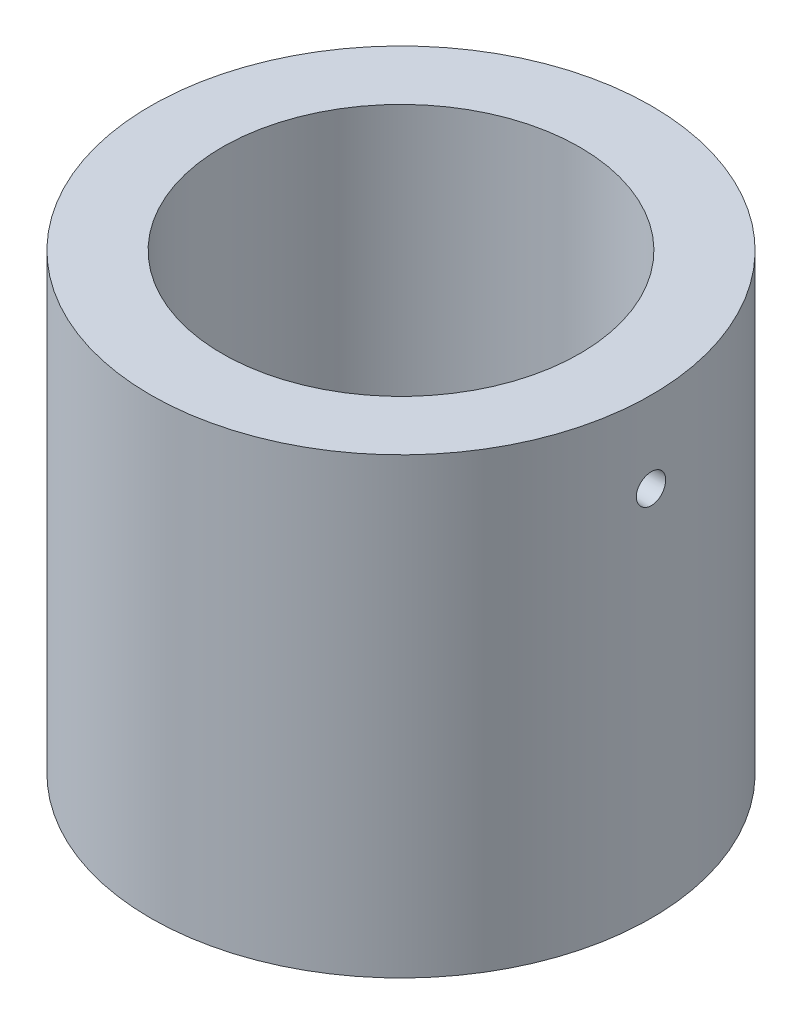
ISO-10303-21;
HEADER;
FILE_DESCRIPTION(('STEP AP214'),'2;1');
FILE_NAME('part.step','',(''),(''),'','','');
FILE_SCHEMA(('AUTOMOTIVE_DESIGN { 1 0 10303 214 1 1 1 1 }'));
ENDSEC;
DATA;
#1=APPLICATION_CONTEXT('core data for automotive mechanical design processes');
#2=APPLICATION_PROTOCOL_DEFINITION('international standard','automotive_design',2000,#1);
#3=PRODUCT_CONTEXT('',#1,'mechanical');
#4=PRODUCT('Part','Part','',(#3));
#5=PRODUCT_RELATED_PRODUCT_CATEGORY('part','',(#4));
#6=PRODUCT_DEFINITION_FORMATION('','',#4);
#7=PRODUCT_DEFINITION_CONTEXT('part definition',#1,'design');
#8=PRODUCT_DEFINITION('design','',#6,#7);
#9=PRODUCT_DEFINITION_SHAPE('','',#8);
#10=(LENGTH_UNIT() NAMED_UNIT(*) SI_UNIT(.MILLI.,.METRE.));
#11=(NAMED_UNIT(*) PLANE_ANGLE_UNIT() SI_UNIT($,.RADIAN.));
#12=(NAMED_UNIT(*) SI_UNIT($,.STERADIAN.) SOLID_ANGLE_UNIT());
#13=UNCERTAINTY_MEASURE_WITH_UNIT(LENGTH_MEASURE(1.E-05),#10,'distance_accuracy_value','');
#14=(GEOMETRIC_REPRESENTATION_CONTEXT(3) GLOBAL_UNCERTAINTY_ASSIGNED_CONTEXT((#13)) GLOBAL_UNIT_ASSIGNED_CONTEXT((#10,
#11,#12)) REPRESENTATION_CONTEXT('',''));
#15=CARTESIAN_POINT('',(0.,0.,0.));
#16=DIRECTION('',(0.,0.,1.));
#17=DIRECTION('',(1.,0.,0.));
#18=AXIS2_PLACEMENT_3D('',#15,#16,#17);
#19=CARTESIAN_POINT('',(105.,156.,0.));
#20=DIRECTION('',(1.,0.,0.));
#21=DIRECTION('',(0.,0.,-1.));
#22=AXIS2_PLACEMENT_3D('',#19,#20,#21);
#23=CYLINDRICAL_SURFACE('',#22,5.35);
#24=CARTESIAN_POINT('',(87.3100000000022,156.,0.));
#25=DIRECTION('',(1.,0.,0.));
#26=DIRECTION('',(0.,0.,-1.));
#27=AXIS2_PLACEMENT_3D('',#24,#25,#26);
#28=CIRCLE('',#27,5.35000000002131);
#29=CARTESIAN_POINT('',(87.3100000000022,156.,-5.35000000002128));
#30=VERTEX_POINT('',#29);
#31=EDGE_CURVE('E66',#30,#30,#28,.F.);
#32=ORIENTED_EDGE('',*,*,#31,.T.);
#33=EDGE_LOOP('',(#32));
#34=FACE_BOUND('',#33,.T.);
#35=CARTESIAN_POINT('',(94.,156.,0.));
#36=DIRECTION('',(1.,0.,0.));
#37=DIRECTION('',(0.,0.,-1.));
#38=AXIS2_PLACEMENT_3D('',#35,#36,#37);
#39=CIRCLE('',#38,5.35);
#40=CARTESIAN_POINT('',(94.,156.,-5.34999999999997));
#41=VERTEX_POINT('',#40);
#42=EDGE_CURVE('E19',#41,#41,#39,.T.);
#43=ORIENTED_EDGE('',*,*,#42,.T.);
#44=EDGE_LOOP('',(#43));
#45=FACE_BOUND('',#44,.T.);
#46=ADVANCED_FACE('F16',(#34,#45),#23,.F.);
#47=CARTESIAN_POINT('',(87.3099999999454,156.,0.));
#48=DIRECTION('',(1.,0.,0.));
#49=DIRECTION('',(0.,0.,-1.));
#50=AXIS2_PLACEMENT_3D('',#47,#48,#49);
#51=CONICAL_SURFACE('',#50,5.34999999990762,1.02974425869842);
#52=ORIENTED_EDGE('',*,*,#31,.F.);
#53=EDGE_LOOP('',(#52));
#54=FACE_BOUND('',#53,.T.);
#55=CARTESIAN_POINT('',(86.6790963500211,156.,0.));
#56=DIRECTION('',(1.,0.,0.));
#57=DIRECTION('',(0.,0.,-1.));
#58=AXIS2_PLACEMENT_3D('',#55,#56,#57);
#59=CIRCLE('',#58,4.3);
#60=CARTESIAN_POINT('',(86.6790963500211,156.,-4.29999999999998));
#61=VERTEX_POINT('',#60);
#62=EDGE_CURVE('E61',#61,#61,#59,.F.);
#63=ORIENTED_EDGE('',*,*,#62,.T.);
#64=EDGE_LOOP('',(#63));
#65=FACE_BOUND('',#64,.T.);
#66=ADVANCED_FACE('F160',(#54,#65),#51,.F.);
#67=CARTESIAN_POINT('',(94.,161.35,0.));
#68=DIRECTION('',(-1.,0.,0.));
#69=DIRECTION('',(0.,0.,1.));
#70=AXIS2_PLACEMENT_3D('',#67,#68,#69);
#71=PLANE('',#70);
#72=CARTESIAN_POINT('',(93.9999999999941,156.,0.));
#73=DIRECTION('',(1.,0.,0.));
#74=DIRECTION('',(0.,1.,0.));
#75=AXIS2_PLACEMENT_3D('',#72,#73,#74);
#76=CIRCLE('',#75,5.81061716828304);
#77=CARTESIAN_POINT('',(93.9999999999941,161.810617168283,0.));
#78=VERTEX_POINT('',#77);
#79=EDGE_CURVE('E55',#78,#78,#76,.T.);
#80=ORIENTED_EDGE('',*,*,#79,.T.);
#81=EDGE_LOOP('',(#80));
#82=FACE_BOUND('',#81,.T.);
#83=ORIENTED_EDGE('',*,*,#42,.F.);
#84=EDGE_LOOP('',(#83));
#85=FACE_BOUND('',#84,.T.);
#86=ADVANCED_FACE('F48',(#82,#85),#71,.F.);
#87=CARTESIAN_POINT('',(77.9422863405999,29.9999999999159,44.9999999999993));
#88=DIRECTION('',(0.,-1.,0.));
#89=DIRECTION('',(0.,0.,-1.));
#90=AXIS2_PLACEMENT_3D('',#87,#88,#89);
#91=CONICAL_SURFACE('',#90,4.25000000011024,1.02974425867368);
#92=CARTESIAN_POINT('',(77.9422863405999,32.5536576308423,44.9999999999993));
#93=VERTEX_POINT('',#92);
#94=VERTEX_LOOP('',#93);
#95=FACE_BOUND('',#94,.T.);
#96=CARTESIAN_POINT('',(77.9422863405999,30.,44.9999999999993));
#97=DIRECTION('',(0.,-1.,0.));
#98=DIRECTION('',(0.,0.,-1.));
#99=AXIS2_PLACEMENT_3D('',#96,#97,#98);
#100=CIRCLE('',#99,4.25);
#101=CARTESIAN_POINT('',(77.9422863405999,30.,40.7499999999993));
#102=VERTEX_POINT('',#101);
#103=EDGE_CURVE('E52',#102,#102,#100,.T.);
#104=ORIENTED_EDGE('',*,*,#103,.T.);
#105=EDGE_LOOP('',(#104));
#106=FACE_BOUND('',#105,.T.);
#107=ADVANCED_FACE('F44',(#95,#106),#91,.F.);
#108=CARTESIAN_POINT('',(0.,29.9999999999159,90.));
#109=DIRECTION('',(0.,-1.,0.));
#110=DIRECTION('',(0.,0.,-1.));
#111=AXIS2_PLACEMENT_3D('',#108,#109,#110);
#112=CONICAL_SURFACE('',#111,4.24999999998135,1.02974425867099);
#113=CARTESIAN_POINT('',(0.,32.5536576307855,90.));
#114=VERTEX_POINT('',#113);
#115=VERTEX_LOOP('',#114);
#116=FACE_BOUND('',#115,.T.);
#117=CARTESIAN_POINT('',(0.,30.,90.));
#118=DIRECTION('',(0.,-1.,0.));
#119=DIRECTION('',(0.,0.,-1.));
#120=AXIS2_PLACEMENT_3D('',#117,#118,#119);
#121=CIRCLE('',#120,4.25);
#122=CARTESIAN_POINT('',(0.,30.,85.75));
#123=VERTEX_POINT('',#122);
#124=EDGE_CURVE('E54',#123,#123,#121,.T.);
#125=ORIENTED_EDGE('',*,*,#124,.T.);
#126=EDGE_LOOP('',(#125));
#127=FACE_BOUND('',#126,.T.);
#128=ADVANCED_FACE('F47',(#116,#127),#112,.F.);
#129=CARTESIAN_POINT('',(-77.9422863405993,29.9999999999159,45.));
#130=DIRECTION('',(0.,-1.,0.));
#131=DIRECTION('',(0.,0.,-1.));
#132=AXIS2_PLACEMENT_3D('',#129,#130,#131);
#133=CONICAL_SURFACE('',#132,4.25000000011133,1.02974425867368);
#134=CARTESIAN_POINT('',(-77.9422863405993,32.5536576308423,45.));
#135=VERTEX_POINT('',#134);
#136=VERTEX_LOOP('',#135);
#137=FACE_BOUND('',#136,.T.);
#138=CARTESIAN_POINT('',(-77.9422863405993,30.,45.));
#139=DIRECTION('',(0.,-1.,0.));
#140=DIRECTION('',(0.,0.,-1.));
#141=AXIS2_PLACEMENT_3D('',#138,#139,#140);
#142=CIRCLE('',#141,4.25);
#143=CARTESIAN_POINT('',(-77.9422863405993,30.,40.75));
#144=VERTEX_POINT('',#143);
#145=EDGE_CURVE('E58',#144,#144,#142,.T.);
#146=ORIENTED_EDGE('',*,*,#145,.T.);
#147=EDGE_LOOP('',(#146));
#148=FACE_BOUND('',#147,.T.);
#149=ADVANCED_FACE('F151',(#137,#148),#133,.F.);
#150=CARTESIAN_POINT('',(105.,156.,0.));
#151=DIRECTION('',(1.,0.,0.));
#152=DIRECTION('',(0.,0.,-1.));
#153=AXIS2_PLACEMENT_3D('',#150,#151,#152);
#154=CYLINDRICAL_SURFACE('',#153,4.3);
#155=ORIENTED_EDGE('',*,*,#62,.F.);
#156=EDGE_LOOP('',(#155));
#157=FACE_BOUND('',#156,.T.);
#158=CARTESIAN_POINT('',(74.8766318686945,156.,-4.3));
#159=CARTESIAN_POINT('',(74.8766319703666,155.879390201993,-4.29999933875741));
#160=CARTESIAN_POINT('',(74.8769240620509,155.758759124029,-4.2949213108703));
#161=CARTESIAN_POINT('',(74.8780846514658,155.518306028432,-4.27463907537663));
#162=CARTESIAN_POINT('',(74.8789534313989,155.398484435935,-4.25942991008094));
#163=CARTESIAN_POINT('',(74.8812447987837,155.160344519866,-4.21895590666755));
#164=CARTESIAN_POINT('',(74.8826683245811,155.042029095999,-4.19367402905396));
#165=CARTESIAN_POINT('',(74.8860291858768,154.807911839557,-4.13322491484742));
#166=CARTESIAN_POINT('',(74.8879667148442,154.692110971246,-4.09805395573588));
#167=CARTESIAN_POINT('',(74.8922973436954,154.464035751351,-4.0181334841971));
#168=CARTESIAN_POINT('',(74.8946898670501,154.351757144178,-3.97339608469525));
#169=CARTESIAN_POINT('',(74.8998650409231,154.131329425107,-3.87461767184731));
#170=CARTESIAN_POINT('',(74.9026478351521,154.023181853143,-3.82057322965908));
#171=CARTESIAN_POINT('',(74.9085213966312,153.811913994489,-3.70362595773787));
#172=CARTESIAN_POINT('',(74.9116119057835,153.708789600923,-3.64073053381691));
#173=CARTESIAN_POINT('',(74.9180164771672,153.508163109459,-3.50646882168363));
#174=CARTESIAN_POINT('',(74.9213306215703,153.410663102845,-3.43509941242239));
#175=CARTESIAN_POINT('',(74.9280904875952,153.221934661241,-3.28434946739866));
#176=CARTESIAN_POINT('',(74.9315363192341,153.130711656724,-3.20496213796759));
#177=CARTESIAN_POINT('',(74.9384605045309,152.955241678173,-3.03875887157369));
#178=CARTESIAN_POINT('',(74.9419388697332,152.870997293773,-2.95194020106611));
#179=CARTESIAN_POINT('',(74.9488272874347,152.710141505487,-2.7715395872098));
#180=CARTESIAN_POINT('',(74.9522373587818,152.633527971751,-2.67795954368378));
#181=CARTESIAN_POINT('',(74.9588948247911,152.488423426925,-2.48464129697392));
#182=CARTESIAN_POINT('',(74.9621421589331,152.419935424868,-2.3849008331361));
#183=CARTESIAN_POINT('',(74.9683816163974,152.291583282942,-2.17996942286971));
#184=CARTESIAN_POINT('',(74.9713736666864,152.231721607594,-2.07477693043576));
#185=CARTESIAN_POINT('',(74.9770177032791,152.121051807519,-1.85967672452513));
#186=CARTESIAN_POINT('',(74.9796695634095,152.070247039206,-1.74976728163103));
#187=CARTESIAN_POINT('',(74.984555503503,151.97809905082,-1.52608376862815));
#188=CARTESIAN_POINT('',(74.9867897452681,151.93675216499,-1.41231121551533));
#189=CARTESIAN_POINT('',(74.9907795155662,151.863779475811,-1.18166616350072));
#190=CARTESIAN_POINT('',(74.9925348648693,151.832157311467,-1.06479252189507));
#191=CARTESIAN_POINT('',(74.996996981212,151.752349551802,-0.711129728391078));
#192=CARTESIAN_POINT('',(74.9989109625838,151.719019382795,-0.470803700503641));
#193=CARTESIAN_POINT('',(75.0003874811966,151.693225751948,0.0120375571609159));
#194=CARTESIAN_POINT('',(74.9999500372058,151.700761963929,0.254552769449428));
#195=CARTESIAN_POINT('',(74.9975798333162,151.742408417915,0.61444614981278));
#196=CARTESIAN_POINT('',(74.996504194567,151.761345788276,0.733757829748426));
#197=CARTESIAN_POINT('',(74.9938155959553,151.809180275202,0.970345796753405));
#198=CARTESIAN_POINT('',(74.9922028372171,151.83807366388,1.08762282842791));
#199=CARTESIAN_POINT('',(74.988484015169,151.905630029514,1.31936103210884));
#200=CARTESIAN_POINT('',(74.9863777625863,151.944296755347,1.43382110504997));
#201=CARTESIAN_POINT('',(74.9817329592243,152.031101480756,1.65903623638171));
#202=CARTESIAN_POINT('',(74.9791945675344,152.079235995832,1.7697926403669));
#203=CARTESIAN_POINT('',(74.9737539173556,152.184695279643,1.98696669518254));
#204=CARTESIAN_POINT('',(74.9708512989361,152.242029155065,2.09337991426883));
#205=CARTESIAN_POINT('',(74.9647674760036,152.365422067591,2.30095991973105));
#206=CARTESIAN_POINT('',(74.9615863742285,152.43147789153,2.40212861916648));
#207=CARTESIAN_POINT('',(74.9550336499912,152.571882955713,2.59857538800721));
#208=CARTESIAN_POINT('',(74.9516619723061,152.646234605961,2.69385173307737));
#209=CARTESIAN_POINT('',(74.944825575303,152.802660211541,2.87777468025992));
#210=CARTESIAN_POINT('',(74.9413608906363,152.884731318614,2.96642370616355));
#211=CARTESIAN_POINT('',(74.9344296279107,153.056177695819,3.13664244672368));
#212=CARTESIAN_POINT('',(74.9309630558509,153.145564563544,3.21820048093147));
#213=CARTESIAN_POINT('',(74.9241332552834,153.330859563798,3.37346923022279));
#214=CARTESIAN_POINT('',(74.9207699891963,153.426765283204,3.44718282348527));
#215=CARTESIAN_POINT('',(74.9142381385216,153.624531792138,3.58633261146814));
#216=CARTESIAN_POINT('',(74.9110697200049,153.726397521041,3.65176179422146));
#217=CARTESIAN_POINT('',(74.9050218968022,153.935249411595,3.77378146300433));
#218=CARTESIAN_POINT('',(74.9021423855522,154.042233663606,3.8303752123133));
#219=CARTESIAN_POINT('',(74.896749601917,154.260735001907,3.93441450377641));
#220=CARTESIAN_POINT('',(74.8942367926136,154.372257596032,3.98184850273868));
#221=CARTESIAN_POINT('',(74.8896543522609,154.598873555457,4.06712369879688));
#222=CARTESIAN_POINT('',(74.8875845541899,154.713965556236,4.10496851214621));
#223=CARTESIAN_POINT('',(74.8839491600236,154.946737296555,4.17076039193381));
#224=CARTESIAN_POINT('',(74.8823827104843,155.064412290645,4.19872422001601));
#225=CARTESIAN_POINT('',(74.879794508965,155.301658237646,4.24463260585009));
#226=CARTESIAN_POINT('',(74.8787724896961,155.421228230457,4.26258208036992));
#227=CARTESIAN_POINT('',(74.8775701453801,155.617481614648,4.28363751916842));
#228=CARTESIAN_POINT('',(74.8772186818319,155.693851985165,4.28977147749549));
#229=CARTESIAN_POINT('',(74.876749511197,155.846812042751,4.29795292800042));
#230=CARTESIAN_POINT('',(74.8766318041234,155.923401729832,4.30000041994963));
#231=CARTESIAN_POINT('',(74.8766319703666,156.120609798007,4.2999993387574));
#232=CARTESIAN_POINT('',(74.8769240620509,156.241240875971,4.29492131087033));
#233=CARTESIAN_POINT('',(74.8780846514658,156.481693971568,4.27463907537669));
#234=CARTESIAN_POINT('',(74.8789534313989,156.601515564065,4.25942991008098));
#235=CARTESIAN_POINT('',(74.8812447987837,156.839655480134,4.21895590666758));
#236=CARTESIAN_POINT('',(74.8826683245811,156.957970904001,4.193674029054));
#237=CARTESIAN_POINT('',(74.8860291858768,157.192088160443,4.13322491484746));
#238=CARTESIAN_POINT('',(74.8879667148442,157.307889028754,4.09805395573591));
#239=CARTESIAN_POINT('',(74.8922973436954,157.535964248649,4.01813348419712));
#240=CARTESIAN_POINT('',(74.8946898670501,157.648242855822,3.97339608469525));
#241=CARTESIAN_POINT('',(74.8998650409231,157.868670574893,3.87461767184729));
#242=CARTESIAN_POINT('',(74.9026478351521,157.976818146857,3.82057322965905));
#243=CARTESIAN_POINT('',(74.9085213966312,158.188086005511,3.70362595773777));
#244=CARTESIAN_POINT('',(74.9116119057835,158.291210399078,3.64073053381676));
#245=CARTESIAN_POINT('',(74.9180164771672,158.491836890541,3.50646882168355));
#246=CARTESIAN_POINT('',(74.9213306215703,158.589336897156,3.43509941242245));
#247=CARTESIAN_POINT('',(74.9280904875952,158.77806533876,3.28434946739869));
#248=CARTESIAN_POINT('',(74.9315363192341,158.869288343277,3.20496213796749));
#249=CARTESIAN_POINT('',(74.9384605045309,159.044758321827,3.0387588715735));
#250=CARTESIAN_POINT('',(74.9419388697332,159.129002706227,2.95194020106599));
#251=CARTESIAN_POINT('',(74.9488272874347,159.289858494513,2.77153958720975));
#252=CARTESIAN_POINT('',(74.9522373587818,159.366472028249,2.67795954368374));
#253=CARTESIAN_POINT('',(74.9588948247911,159.511576573075,2.4846412969739));
#254=CARTESIAN_POINT('',(74.9621421589331,159.580064575133,2.38490083313609));
#255=CARTESIAN_POINT('',(74.9683816163974,159.708416717058,2.17996942286972));
#256=CARTESIAN_POINT('',(74.9713736666864,159.768278392406,2.07477693043576));
#257=CARTESIAN_POINT('',(74.9770177032791,159.878948192481,1.85967672452513));
#258=CARTESIAN_POINT('',(74.9796695634095,159.929752960794,1.74976728163104));
#259=CARTESIAN_POINT('',(74.984555503503,160.02190094918,1.52608376862817));
#260=CARTESIAN_POINT('',(74.9867897452681,160.06324783501,1.41231121551535));
#261=CARTESIAN_POINT('',(74.9907795155662,160.136220524189,1.18166616350075));
#262=CARTESIAN_POINT('',(74.9925348648693,160.167842688533,1.06479252189509));
#263=CARTESIAN_POINT('',(74.996996981212,160.247650448198,0.7111297283911));
#264=CARTESIAN_POINT('',(74.9989109625838,160.280980617205,0.470803700503668));
#265=CARTESIAN_POINT('',(75.0003874811966,160.306774248052,-0.012037557160884));
#266=CARTESIAN_POINT('',(74.9999500372058,160.299238036071,-0.254552769449398));
#267=CARTESIAN_POINT('',(74.9975798333162,160.257591582085,-0.614446149812764));
#268=CARTESIAN_POINT('',(74.996504194567,160.238654211724,-0.733757829748418));
#269=CARTESIAN_POINT('',(74.9938155959553,160.190819724798,-0.970345796753401));
#270=CARTESIAN_POINT('',(74.9922028372171,160.16192633612,-1.0876228284279));
#271=CARTESIAN_POINT('',(74.988484015169,160.094369970486,-1.31936103210883));
#272=CARTESIAN_POINT('',(74.9863777625863,160.055703244653,-1.43382110504995));
#273=CARTESIAN_POINT('',(74.9817329592243,159.968898519244,-1.65903623638169));
#274=CARTESIAN_POINT('',(74.9791945675344,159.920764004168,-1.76979264036689));
#275=CARTESIAN_POINT('',(74.9737539173556,159.815304720357,-1.98696669518252));
#276=CARTESIAN_POINT('',(74.9708512989361,159.757970844935,-2.09337991426879));
#277=CARTESIAN_POINT('',(74.9647674760036,159.634577932409,-2.30095991973102));
#278=CARTESIAN_POINT('',(74.9615863742285,159.56852210847,-2.40212861916646));
#279=CARTESIAN_POINT('',(74.9550336499912,159.428117044287,-2.59857538800719));
#280=CARTESIAN_POINT('',(74.9516619723061,159.353765394039,-2.69385173307734));
#281=CARTESIAN_POINT('',(74.944825575303,159.197339788459,-2.8777746802599));
#282=CARTESIAN_POINT('',(74.9413608906363,159.115268681386,-2.96642370616353));
#283=CARTESIAN_POINT('',(74.9344296279107,158.943822304181,-3.13664244672366));
#284=CARTESIAN_POINT('',(74.9309630558509,158.854435436456,-3.21820048093144));
#285=CARTESIAN_POINT('',(74.9241332552834,158.669140436202,-3.37346923022275));
#286=CARTESIAN_POINT('',(74.9207699891963,158.573234716796,-3.44718282348523));
#287=CARTESIAN_POINT('',(74.9142381385216,158.375468207862,-3.58633261146811));
#288=CARTESIAN_POINT('',(74.9110697200049,158.273602478959,-3.65176179422143));
#289=CARTESIAN_POINT('',(74.9050218968022,158.064750588405,-3.7737814630043));
#290=CARTESIAN_POINT('',(74.9021423855522,157.957766336394,-3.83037521231327));
#291=CARTESIAN_POINT('',(74.896749601917,157.739264998093,-3.93441450377638));
#292=CARTESIAN_POINT('',(74.8942367926136,157.627742403968,-3.98184850273864));
#293=CARTESIAN_POINT('',(74.8896543522609,157.401126444543,-4.06712369879684));
#294=CARTESIAN_POINT('',(74.8875845541899,157.286034443764,-4.10496851214617));
#295=CARTESIAN_POINT('',(74.8839491600236,157.053262703445,-4.17076039193378));
#296=CARTESIAN_POINT('',(74.8823827104843,156.935587709355,-4.19872422001597));
#297=CARTESIAN_POINT('',(74.879794508965,156.698341762354,-4.24463260585005));
#298=CARTESIAN_POINT('',(74.8787724896961,156.578771769543,-4.26258208036989));
#299=CARTESIAN_POINT('',(74.8775701453801,156.382518385352,-4.28363751916837));
#300=CARTESIAN_POINT('',(74.8772186818319,156.306148014835,-4.28977147749544));
#301=CARTESIAN_POINT('',(74.876749511197,156.153187957249,-4.29795292800039));
#302=CARTESIAN_POINT('',(74.8766318041234,156.076598270168,-4.30000041994962));
#303=CARTESIAN_POINT('',(74.8766318686945,156.,-4.3));
#304=B_SPLINE_CURVE_WITH_KNOTS('',3,(#158,#159,#160,#161,#162,#163,#164,#165,#166,#167,#168,
#169,#170,#171,#172,#173,#174,#175,#176,#177,#178,#179,#180,#181,#182,#183,#184,#185,#186,#187,
#188,#189,#190,#191,#192,#193,#194,#195,#196,#197,#198,#199,#200,#201,#202,#203,#204,#205,#206,
#207,#208,#209,#210,#211,#212,#213,#214,#215,#216,#217,#218,#219,#220,#221,#222,#223,#224,#225,
#226,#227,#228,#229,#230,#231,#232,#233,#234,#235,#236,#237,#238,#239,#240,#241,#242,#243,#244,
#245,#246,#247,#248,#249,#250,#251,#252,#253,#254,#255,#256,#257,#258,#259,#260,#261,#262,#263,
#264,#265,#266,#267,#268,#269,#270,#271,#272,#273,#274,#275,#276,#277,#278,#279,#280,#281,#282,
#283,#284,#285,#286,#287,#288,#289,#290,#291,#292,#293,#294,#295,#296,#297,#298,#299,#300,#301,
#302,#303),.UNSPECIFIED.,.T.,.F.,(4,2,2,2,2,2,2,2,2,2,2,2,2,2,2,2,2,2,2,2,2,2,2,2,2,2,2,2,2,2,2,
2,2,2,2,2,2,2,2,2,2,2,2,2,2,2,2,2,2,2,2,2,2,2,2,2,2,2,2,2,2,2,2,2,2,2,2,2,2,2,2,2,4),(0.,
0.361759243969558,0.723695645610769,1.08624693416515,1.44893487999203,1.81116628506166,
2.17353142776327,2.53559515463757,2.8977926490893,3.26029965382399,3.62294058094431,
3.9854800058854,4.34815326949935,4.71092994335827,5.07384078094661,5.43661071960496,
5.79951624255534,6.52374205279389,7.24796208256405,7.61003380354244,7.9719700990776,
8.33404543818255,8.6959877685713,9.05829063114057,9.42046039176536,9.78273564086759,
10.1448777412039,10.5076054947754,10.8701996988367,11.233098781554,11.5958635123907,
11.9590824608138,12.3221642283212,12.6846270900396,13.0469118356561,13.2766620815956,
13.5064123403909,13.8681715843605,14.2301079860017,14.592659274556,14.955347220383,
15.3175786254527,15.6799437681544,16.0420074950288,16.4042049894806,16.7667119942152,
17.1293529213354,17.4918923462764,17.8545656098903,18.2173422837492,18.5802531213376,
18.9430230599959,19.3059285829463,20.0301543931848,20.754374422955,21.1164461439334,
21.4783824394685,21.8404577785735,22.2024001089622,22.5647029715315,22.9268727321563,
23.2891479812585,23.6512900815948,24.0140178351663,24.3766120392276,24.739511121945,
25.1022758527817,25.4654948012047,25.8285765687122,26.1910394304305,26.553324176047,
26.7830744219866,27.0128246807818),.UNSPECIFIED.);
#305=CARTESIAN_POINT('',(74.8766318686945,156.,-4.3));
#306=VERTEX_POINT('',#305);
#307=EDGE_CURVE('E138',#306,#306,#304,.T.);
#308=ORIENTED_EDGE('',*,*,#307,.T.);
#309=EDGE_LOOP('',(#308));
#310=FACE_BOUND('',#309,.T.);
#311=ADVANCED_FACE('F145',(#157,#310),#154,.F.);
#312=CARTESIAN_POINT('',(0.,29.9999999999159,-90.));
#313=DIRECTION('',(0.,-1.,0.));
#314=DIRECTION('',(0.,0.,-1.));
#315=AXIS2_PLACEMENT_3D('',#312,#313,#314);
#316=CONICAL_SURFACE('',#315,4.24999999998818,1.0297442586717);
#317=CARTESIAN_POINT('',(0.,32.5536576307855,-90.));
#318=VERTEX_POINT('',#317);
#319=VERTEX_LOOP('',#318);
#320=FACE_BOUND('',#319,.T.);
#321=CARTESIAN_POINT('',(0.,30.,-90.));
#322=DIRECTION('',(0.,-1.,0.));
#323=DIRECTION('',(0.,0.,-1.));
#324=AXIS2_PLACEMENT_3D('',#321,#322,#323);
#325=CIRCLE('',#324,4.25);
#326=CARTESIAN_POINT('',(0.,30.,-94.25));
#327=VERTEX_POINT('',#326);
#328=EDGE_CURVE('E144',#327,#327,#325,.T.);
#329=ORIENTED_EDGE('',*,*,#328,.T.);
#330=EDGE_LOOP('',(#329));
#331=FACE_BOUND('',#330,.T.);
#332=ADVANCED_FACE('F150',(#320,#331),#316,.F.);
#333=CARTESIAN_POINT('',(-77.9422863405996,29.9999999999727,-45.));
#334=DIRECTION('',(0.,-1.,0.));
#335=DIRECTION('',(0.,0.,-1.));
#336=AXIS2_PLACEMENT_3D('',#333,#334,#335);
#337=CONICAL_SURFACE('',#336,4.25000000002929,1.0297442586717);
#338=CARTESIAN_POINT('',(-77.9422863405996,32.5536576308423,-45.));
#339=VERTEX_POINT('',#338);
#340=VERTEX_LOOP('',#339);
#341=FACE_BOUND('',#340,.T.);
#342=CARTESIAN_POINT('',(-77.9422863405996,30.,-45.));
#343=DIRECTION('',(0.,-1.,0.));
#344=DIRECTION('',(0.,0.,-1.));
#345=AXIS2_PLACEMENT_3D('',#342,#343,#344);
#346=CIRCLE('',#345,4.25);
#347=CARTESIAN_POINT('',(-77.9422863405996,30.,-49.25));
#348=VERTEX_POINT('',#347);
#349=EDGE_CURVE('E341',#348,#348,#346,.T.);
#350=ORIENTED_EDGE('',*,*,#349,.T.);
#351=EDGE_LOOP('',(#350));
#352=FACE_BOUND('',#351,.T.);
#353=ADVANCED_FACE('F231',(#341,#352),#337,.F.);
#354=CARTESIAN_POINT('',(77.942286340599,30.0000000000295,-45.0000000000009));
#355=DIRECTION('',(0.,-1.,0.));
#356=DIRECTION('',(1.,0.,0.));
#357=AXIS2_PLACEMENT_3D('',#354,#355,#356);
#358=CONICAL_SURFACE('',#357,4.2500000000282,1.02974425867562);
#359=CARTESIAN_POINT('',(77.942286340599,32.5536576308423,-45.0000000000009));
#360=VERTEX_POINT('',#359);
#361=VERTEX_LOOP('',#360);
#362=FACE_BOUND('',#361,.T.);
#363=CARTESIAN_POINT('',(77.942286340599,30.,-45.0000000000009));
#364=DIRECTION('',(0.,-1.,0.));
#365=DIRECTION('',(0.,0.,-1.));
#366=AXIS2_PLACEMENT_3D('',#363,#364,#365);
#367=CIRCLE('',#366,4.25);
#368=CARTESIAN_POINT('',(77.942286340599,30.,-49.2500000000009));
#369=VERTEX_POINT('',#368);
#370=EDGE_CURVE('E344',#369,#369,#367,.T.);
#371=ORIENTED_EDGE('',*,*,#370,.T.);
#372=EDGE_LOOP('',(#371));
#373=FACE_BOUND('',#372,.T.);
#374=ADVANCED_FACE('F240',(#362,#373),#358,.F.);
#375=CARTESIAN_POINT('',(105.066013292117,156.,0.));
#376=DIRECTION('',(1.,0.,0.));
#377=DIRECTION('',(0.,1.,0.));
#378=AXIS2_PLACEMENT_3D('',#375,#376,#377);
#379=CONICAL_SURFACE('',#378,6.15606071192512,0.0312064870254938);
#380=ORIENTED_EDGE('',*,*,#79,.F.);
#381=EDGE_LOOP('',(#380));
#382=FACE_BOUND('',#381,.T.);
#383=CARTESIAN_POINT('',(104.819833404408,156.,6.14837580765668));
#384=CARTESIAN_POINT('',(104.8198335529,156.172718410946,6.14837486483486));
#385=CARTESIAN_POINT('',(104.820260662285,156.345467203998,6.14110511948876));
#386=CARTESIAN_POINT('',(104.82195773088,156.689806690943,6.1120686404115));
#387=CARTESIAN_POINT('',(104.823228102292,156.861396776981,6.09029481681706));
#388=CARTESIAN_POINT('',(104.826578659268,157.202424999739,6.03235030886717));
#389=CARTESIAN_POINT('',(104.82866021631,157.371858987459,5.99615524005002));
#390=CARTESIAN_POINT('',(104.83357466712,157.707128378912,5.90961074485103));
#391=CARTESIAN_POINT('',(104.836407843667,157.872962402785,5.85925599079124));
#392=CARTESIAN_POINT('',(104.842740428789,158.199583858965,5.74482862409616));
#393=CARTESIAN_POINT('',(104.846239006301,158.36037729805,5.68077311095299));
#394=CARTESIAN_POINT('',(104.853806633146,158.676049950756,5.53933646138703));
#395=CARTESIAN_POINT('',(104.857875892627,158.830926958848,5.46195041370353));
#396=CARTESIAN_POINT('',(104.866464680703,159.133479336748,5.2944881741171));
#397=CARTESIAN_POINT('',(104.870983831855,159.28116059113,5.20442259402196));
#398=CARTESIAN_POINT('',(104.88034883964,159.568467041467,5.01215425600899));
#399=CARTESIAN_POINT('',(104.885194816306,159.708089242255,4.90994702822784));
#400=CARTESIAN_POINT('',(104.895077145406,159.978299385366,4.69408835637838));
#401=CARTESIAN_POINT('',(104.900113595308,160.108882602812,4.58043100216105));
#402=CARTESIAN_POINT('',(104.910233470731,160.360054776559,4.3424757007363));
#403=CARTESIAN_POINT('',(104.915316912924,160.48064002161,4.2181738367802));
#404=CARTESIAN_POINT('',(104.925383172696,160.710871847596,3.959881416155));
#405=CARTESIAN_POINT('',(104.930366018347,160.820521514758,3.82589361155925));
#406=CARTESIAN_POINT('',(104.940092938878,161.028177905111,3.5490950043638));
#407=CARTESIAN_POINT('',(104.944836924991,161.126180317983,3.40628096496005));
#408=CARTESIAN_POINT('',(104.953946800726,161.309743506073,3.11296672771363));
#409=CARTESIAN_POINT('',(104.958312897762,161.395311124201,2.96247081931781));
#410=CARTESIAN_POINT('',(104.966547478805,161.553484892132,2.65473452547595));
#411=CARTESIAN_POINT('',(104.97041577821,161.626086237437,2.49749166668288));
#412=CARTESIAN_POINT('',(104.977541207212,161.757740783033,2.17747974450283));
#413=CARTESIAN_POINT('',(104.980798576234,161.816799292827,2.01471287564898));
#414=CARTESIAN_POINT('',(104.986613158988,161.920994965309,1.68474779796561));
#415=CARTESIAN_POINT('',(104.989170110738,161.966126919718,1.51754795660867));
#416=CARTESIAN_POINT('',(104.995661670155,162.079890475241,1.01189534262678));
#417=CARTESIAN_POINT('',(104.998439633887,162.127294563717,0.668402422691164));
#418=CARTESIAN_POINT('',(105.000564505716,162.163671158205,-0.0216718944252766));
#419=CARTESIAN_POINT('',(104.99991145255,162.152644323925,-0.368253256692216));
#420=CARTESIAN_POINT('',(104.996432732198,162.092737616135,-0.882467163947546));
#421=CARTESIAN_POINT('',(104.994857417443,162.06555450048,-1.05288235362492));
#422=CARTESIAN_POINT('',(104.990924110877,161.996965234041,-1.39079438605759));
#423=CARTESIAN_POINT('',(104.988566412041,161.955564407108,-1.55829229656165));
#424=CARTESIAN_POINT('',(104.983132663912,161.858813713141,-1.88925570094078));
#425=CARTESIAN_POINT('',(104.980056339409,161.803458501397,-2.05271962334874));
#426=CARTESIAN_POINT('',(104.973274385171,161.679227877367,-2.37434686165006));
#427=CARTESIAN_POINT('',(104.969568986527,161.610357428509,-2.53251209857933));
#428=CARTESIAN_POINT('',(104.961627841566,161.459484484499,-2.84267146788262));
#429=CARTESIAN_POINT('',(104.957391461194,161.377466256176,-2.99465792983884));
#430=CARTESIAN_POINT('',(104.948513317291,161.200975409301,-3.29113073404331));
#431=CARTESIAN_POINT('',(104.943871702873,161.106507365453,-3.43561980416949));
#432=CARTESIAN_POINT('',(104.934311404872,160.905735910112,-3.71618105304897));
#433=CARTESIAN_POINT('',(104.92939264055,160.79942904084,-3.85225075459986));
#434=CARTESIAN_POINT('',(104.919420001174,160.575797717349,-4.11492144507627));
#435=CARTESIAN_POINT('',(104.914366176251,160.458477311664,-4.24152588289196));
#436=CARTESIAN_POINT('',(104.904252290833,160.213326009818,-4.48471870840977));
#437=CARTESIAN_POINT('',(104.8991922438,160.085470945148,-4.60128273478447));
#438=CARTESIAN_POINT('',(104.889223113798,159.820446980319,-4.82319506235508));
#439=CARTESIAN_POINT('',(104.884313976141,159.683281513338,-4.92854746139548));
#440=CARTESIAN_POINT('',(104.874779753391,159.400446572194,-5.12742577740064));
#441=CARTESIAN_POINT('',(104.870154911241,159.254770026692,-5.22094164986345));
#442=CARTESIAN_POINT('',(104.861326714185,158.956106073454,-5.39534843682305));
#443=CARTESIAN_POINT('',(104.857123204413,158.803121382709,-5.47624399626124));
#444=CARTESIAN_POINT('',(104.849246619011,158.490540760277,-5.62503771001236));
#445=CARTESIAN_POINT('',(104.845574699553,158.330931361679,-5.69290763580386));
#446=CARTESIAN_POINT('',(104.838878091227,158.006605702376,-5.81492699250136));
#447=CARTESIAN_POINT('',(104.835853159254,157.841891386569,-5.86908157834988));
#448=CARTESIAN_POINT('',(104.83053960025,157.508761094315,-5.96323633578382));
#449=CARTESIAN_POINT('',(104.828249730606,157.34035188458,-6.00326040636951));
#450=CARTESIAN_POINT('',(104.824465427106,157.000821118608,-6.06898159735493));
#451=CARTESIAN_POINT('',(104.822970603857,156.829700932495,-6.09468573153333));
#452=CARTESIAN_POINT('',(104.821209516668,156.548604497211,-6.12488056296476));
#453=CARTESIAN_POINT('',(104.820694047853,156.439075253254,-6.1336884574489));
#454=CARTESIAN_POINT('',(104.820005944499,156.219701436604,-6.14543637963074));
#455=CARTESIAN_POINT('',(104.81983330996,156.109856863912,-6.14837640733477));
#456=CARTESIAN_POINT('',(104.8198335529,155.827281589054,-6.14837486483475));
#457=CARTESIAN_POINT('',(104.820260662285,155.654532796002,-6.14110511948869));
#458=CARTESIAN_POINT('',(104.82195773088,155.310193309057,-6.11206864041148));
#459=CARTESIAN_POINT('',(104.823228102292,155.138603223019,-6.09029481681705));
#460=CARTESIAN_POINT('',(104.826578659268,154.797575000261,-6.03235030886711));
#461=CARTESIAN_POINT('',(104.82866021631,154.628141012541,-5.99615524004987));
#462=CARTESIAN_POINT('',(104.83357466712,154.292871621089,-5.90961074485113));
#463=CARTESIAN_POINT('',(104.836407843667,154.127037597215,-5.85925599079169));
#464=CARTESIAN_POINT('',(104.842740428789,153.800416141035,-5.74482862409661));
#465=CARTESIAN_POINT('',(104.846239006301,153.63962270195,-5.68077311095309));
#466=CARTESIAN_POINT('',(104.853806633146,153.323950049245,-5.53933646138689));
#467=CARTESIAN_POINT('',(104.857875892627,153.169073041152,-5.46195041370349));
#468=CARTESIAN_POINT('',(104.866464680703,152.866520663252,-5.29448817411702));
#469=CARTESIAN_POINT('',(104.870983831855,152.71883940887,-5.20442259402174));
#470=CARTESIAN_POINT('',(104.88034883964,152.431532958533,-5.012154256009));
#471=CARTESIAN_POINT('',(104.885194816306,152.291910757744,-4.90994702822823));
#472=CARTESIAN_POINT('',(104.895077145406,152.021700614634,-4.69408835637878));
#473=CARTESIAN_POINT('',(104.900113595308,151.891117397188,-4.58043100216109));
#474=CARTESIAN_POINT('',(104.910233470731,151.639945223441,-4.34247570073609));
#475=CARTESIAN_POINT('',(104.915316912924,151.51935997839,-4.21817383678009));
#476=CARTESIAN_POINT('',(104.925383172696,151.289128152404,-3.95988141615491));
#477=CARTESIAN_POINT('',(104.930366018347,151.179478485242,-3.82589361155907));
#478=CARTESIAN_POINT('',(104.940092938878,150.971822094889,-3.54909500436379));
#479=CARTESIAN_POINT('',(104.944836924991,150.873819682017,-3.40628096496029));
#480=CARTESIAN_POINT('',(104.953946800726,150.690256493926,-3.11296672771391));
#481=CARTESIAN_POINT('',(104.958312897762,150.604688875799,-2.96247081931788));
#482=CARTESIAN_POINT('',(104.966547478805,150.446515107868,-2.65473452547587));
#483=CARTESIAN_POINT('',(104.97041577821,150.373913762563,-2.49749166668286));
#484=CARTESIAN_POINT('',(104.977541207212,150.242259216967,-2.17747974450282));
#485=CARTESIAN_POINT('',(104.980798576234,150.183200707173,-2.01471287564892));
#486=CARTESIAN_POINT('',(104.986613158988,150.079005034691,-1.68474779796559));
#487=CARTESIAN_POINT('',(104.989170110738,150.033873080281,-1.51754795660873));
#488=CARTESIAN_POINT('',(104.995661670155,149.920109524758,-1.01189534262694));
#489=CARTESIAN_POINT('',(104.998439633887,149.872705436283,-0.668402422691217));
#490=CARTESIAN_POINT('',(105.000564505716,149.836328841795,0.0216718944253653));
#491=CARTESIAN_POINT('',(104.99991145255,149.847355676074,0.368253256692338));
#492=CARTESIAN_POINT('',(104.996432732198,149.907262383865,0.88246716394757));
#493=CARTESIAN_POINT('',(104.994857417443,149.93444549952,1.05288235362488));
#494=CARTESIAN_POINT('',(104.990924110877,150.003034765959,1.39079438605752));
#495=CARTESIAN_POINT('',(104.988566412041,150.044435592892,1.55829229656163));
#496=CARTESIAN_POINT('',(104.983132663912,150.141186286859,1.88925570094077));
#497=CARTESIAN_POINT('',(104.980056339409,150.196541498603,2.05271962334871));
#498=CARTESIAN_POINT('',(104.973274385171,150.320772122633,2.37434686165015));
#499=CARTESIAN_POINT('',(104.969568986527,150.38964257149,2.53251209857957));
#500=CARTESIAN_POINT('',(104.961627841566,150.5405155155,2.84267146788283));
#501=CARTESIAN_POINT('',(104.957391461194,150.622533743824,2.99465792983887));
#502=CARTESIAN_POINT('',(104.948513317291,150.799024590699,3.29113073404324));
#503=CARTESIAN_POINT('',(104.943871702873,150.893492634547,3.4356198041695));
#504=CARTESIAN_POINT('',(104.934311404872,151.094264089888,3.71618105304896));
#505=CARTESIAN_POINT('',(104.92939264055,151.20057095916,3.85225075459977));
#506=CARTESIAN_POINT('',(104.919420001174,151.424202282651,4.11492144507638));
#507=CARTESIAN_POINT('',(104.914366176251,151.541522688335,4.24152588289235));
#508=CARTESIAN_POINT('',(104.904252290833,151.786673990182,4.48471870841015));
#509=CARTESIAN_POINT('',(104.8991922438,151.914529054852,4.60128273478456));
#510=CARTESIAN_POINT('',(104.889223113798,152.179553019681,4.823195062355));
#511=CARTESIAN_POINT('',(104.884313976141,152.316718486662,4.92854746139551));
#512=CARTESIAN_POINT('',(104.874779753391,152.599553427806,5.12742577740072));
#513=CARTESIAN_POINT('',(104.870154911241,152.745229973308,5.22094164986347));
#514=CARTESIAN_POINT('',(104.861326714185,153.043893926546,5.39534843682327));
#515=CARTESIAN_POINT('',(104.857123204413,153.196878617291,5.47624399626172));
#516=CARTESIAN_POINT('',(104.849246619011,153.509459239723,5.62503771001285));
#517=CARTESIAN_POINT('',(104.845574699553,153.669068638321,5.69290763580407));
#518=CARTESIAN_POINT('',(104.838878091227,153.993394297624,5.81492699250141));
#519=CARTESIAN_POINT('',(104.835853159253,154.158108613431,5.86908157835002));
#520=CARTESIAN_POINT('',(104.830539600249,154.491238905686,5.96323633578391));
#521=CARTESIAN_POINT('',(104.828249730606,154.65964811542,6.00326040636946));
#522=CARTESIAN_POINT('',(104.824465427106,154.999178881392,6.06898159735517));
#523=CARTESIAN_POINT('',(104.822970603857,155.170299067505,6.09468573153402));
#524=CARTESIAN_POINT('',(104.821209516668,155.451395502789,6.12488056296524));
#525=CARTESIAN_POINT('',(104.820694047853,155.560924746746,6.13368845744908));
#526=CARTESIAN_POINT('',(104.820005944499,155.780298563396,6.14543637963068));
#527=CARTESIAN_POINT('',(104.81983330996,155.890143136088,6.14837640733478));
#528=CARTESIAN_POINT('',(104.819833404408,156.,6.14837580765668));
#529=B_SPLINE_CURVE_WITH_KNOTS('',3,(#383,#384,#385,#386,#387,#388,#389,#390,#391,#392,#393,
#394,#395,#396,#397,#398,#399,#400,#401,#402,#403,#404,#405,#406,#407,#408,#409,#410,#411,#412,
#413,#414,#415,#416,#417,#418,#419,#420,#421,#422,#423,#424,#425,#426,#427,#428,#429,#430,#431,
#432,#433,#434,#435,#436,#437,#438,#439,#440,#441,#442,#443,#444,#445,#446,#447,#448,#449,#450,
#451,#452,#453,#454,#455,#456,#457,#458,#459,#460,#461,#462,#463,#464,#465,#466,#467,#468,#469,
#470,#471,#472,#473,#474,#475,#476,#477,#478,#479,#480,#481,#482,#483,#484,#485,#486,#487,#488,
#489,#490,#491,#492,#493,#494,#495,#496,#497,#498,#499,#500,#501,#502,#503,#504,#505,#506,#507,
#508,#509,#510,#511,#512,#513,#514,#515,#516,#517,#518,#519,#520,#521,#522,#523,#524,#525,#526,
#527,#528),.UNSPECIFIED.,.T.,.F.,(4,2,2,2,2,2,2,2,2,2,2,2,2,2,2,2,2,2,2,2,2,2,2,2,2,2,2,2,2,2,2,
2,2,2,2,2,2,2,2,2,2,2,2,2,2,2,2,2,2,2,2,2,2,2,2,2,2,2,2,2,2,2,2,2,2,2,2,2,2,2,2,2,4),(0.,
0.518054683796902,1.03636278837311,1.55555102970619,2.07493488113633,2.59367424927423,
3.11260514270354,3.631104284038,4.14979490224727,4.66875463540399,5.18790615206772,
5.70691073725014,6.22610679715163,6.74501605091063,7.26411718323407,7.78301445134453,
8.30210554302939,9.33712744496675,10.3721376611075,10.8893563021514,11.4063814804413,
11.9236049877174,12.4406389005828,12.9582962004685,13.4757638140389,13.9933829633874,
14.5108125774611,15.0294642181949,15.5479256361801,16.0668241132096,16.5855311553364,
17.1053499255631,17.6249730297744,18.1437130349686,18.6621987420008,18.9917053802727,
19.321212018189,19.8392667019858,20.3575748065619,20.8767630478951,21.3961468993252,
21.9148862674631,22.4338171608926,22.9523163022271,23.4710069204364,23.9899666535931,
24.5091181702568,25.0281227554393,25.5473188153407,26.0662280690997,26.5853292014231,
27.1042264695336,27.6233175612185,28.6583394631559,29.6933496792966,30.2105683203406,
30.7275934986304,31.2448170059066,31.7618509187721,32.2795082186577,32.7969758322281,
33.3145949815767,33.8320245956503,34.3506762363842,34.8691376543694,35.3880361313991,
35.906743173526,36.4265619437527,36.946185047964,37.4649250531583,37.9834107601903,
38.3129173984622,38.6424240363784),.UNSPECIFIED.);
#530=CARTESIAN_POINT('',(104.819833404408,156.,6.14837580765668));
#531=VERTEX_POINT('',#530);
#532=EDGE_CURVE('E92',#531,#531,#529,.T.);
#533=ORIENTED_EDGE('',*,*,#532,.F.);
#534=EDGE_LOOP('',(#533));
#535=FACE_BOUND('',#534,.T.);
#536=ADVANCED_FACE('F102',(#382,#535),#379,.F.);
#537=CARTESIAN_POINT('',(77.9422863405999,0.,44.9999999999993));
#538=DIRECTION('',(0.,-1.,0.));
#539=DIRECTION('',(0.,0.,-1.));
#540=AXIS2_PLACEMENT_3D('',#537,#538,#539);
#541=CYLINDRICAL_SURFACE('',#540,4.25);
#542=ORIENTED_EDGE('',*,*,#103,.F.);
#543=EDGE_LOOP('',(#542));
#544=FACE_BOUND('',#543,.T.);
#545=CARTESIAN_POINT('',(77.9422863405999,0.,44.9999999999993));
#546=DIRECTION('',(0.,-1.,0.));
#547=DIRECTION('',(0.,0.,-1.));
#548=AXIS2_PLACEMENT_3D('',#545,#546,#547);
#549=CIRCLE('',#548,4.25);
#550=CARTESIAN_POINT('',(77.9422863405999,0.,40.7499999999993));
#551=VERTEX_POINT('',#550);
#552=EDGE_CURVE('E89',#551,#551,#549,.T.);
#553=ORIENTED_EDGE('',*,*,#552,.T.);
#554=EDGE_LOOP('',(#553));
#555=FACE_BOUND('',#554,.T.);
#556=ADVANCED_FACE('F256',(#544,#555),#541,.F.);
#557=CARTESIAN_POINT('',(0.,0.,90.));
#558=DIRECTION('',(0.,-1.,0.));
#559=DIRECTION('',(0.,0.,-1.));
#560=AXIS2_PLACEMENT_3D('',#557,#558,#559);
#561=CYLINDRICAL_SURFACE('',#560,4.25);
#562=ORIENTED_EDGE('',*,*,#124,.F.);
#563=EDGE_LOOP('',(#562));
#564=FACE_BOUND('',#563,.T.);
#565=CARTESIAN_POINT('',(0.,0.,90.));
#566=DIRECTION('',(0.,-1.,0.));
#567=DIRECTION('',(0.,0.,-1.));
#568=AXIS2_PLACEMENT_3D('',#565,#566,#567);
#569=CIRCLE('',#568,4.25);
#570=CARTESIAN_POINT('',(0.,0.,85.75));
#571=VERTEX_POINT('',#570);
#572=EDGE_CURVE('E86',#571,#571,#569,.T.);
#573=ORIENTED_EDGE('',*,*,#572,.T.);
#574=EDGE_LOOP('',(#573));
#575=FACE_BOUND('',#574,.T.);
#576=ADVANCED_FACE('F265',(#564,#575),#561,.F.);
#577=CARTESIAN_POINT('',(-77.9422863405993,0.,45.));
#578=DIRECTION('',(0.,-1.,0.));
#579=DIRECTION('',(0.,0.,-1.));
#580=AXIS2_PLACEMENT_3D('',#577,#578,#579);
#581=CYLINDRICAL_SURFACE('',#580,4.25);
#582=ORIENTED_EDGE('',*,*,#145,.F.);
#583=EDGE_LOOP('',(#582));
#584=FACE_BOUND('',#583,.T.);
#585=CARTESIAN_POINT('',(-77.9422863405993,0.,45.));
#586=DIRECTION('',(0.,-1.,0.));
#587=DIRECTION('',(0.,0.,-1.));
#588=AXIS2_PLACEMENT_3D('',#585,#586,#587);
#589=CIRCLE('',#588,4.25);
#590=CARTESIAN_POINT('',(-77.9422863405993,0.,40.75));
#591=VERTEX_POINT('',#590);
#592=EDGE_CURVE('E83',#591,#591,#589,.T.);
#593=ORIENTED_EDGE('',*,*,#592,.T.);
#594=EDGE_LOOP('',(#593));
#595=FACE_BOUND('',#594,.T.);
#596=ADVANCED_FACE('F135',(#584,#595),#581,.F.);
#597=CARTESIAN_POINT('',(0.,190.,0.));
#598=DIRECTION('',(0.,-1.,0.));
#599=DIRECTION('',(0.,0.,-1.));
#600=AXIS2_PLACEMENT_3D('',#597,#598,#599);
#601=CYLINDRICAL_SURFACE('',#600,75.);
#602=CARTESIAN_POINT('',(0.,0.,0.));
#603=DIRECTION('',(0.,-1.,0.));
#604=DIRECTION('',(0.,0.,-1.));
#605=AXIS2_PLACEMENT_3D('',#602,#603,#604);
#606=CIRCLE('',#605,75.);
#607=CARTESIAN_POINT('',(0.,0.,-75.));
#608=VERTEX_POINT('',#607);
#609=EDGE_CURVE('E80',#608,#608,#606,.T.);
#610=ORIENTED_EDGE('',*,*,#609,.T.);
#611=EDGE_LOOP('',(#610));
#612=FACE_BOUND('',#611,.T.);
#613=CARTESIAN_POINT('',(0.,190.,0.));
#614=DIRECTION('',(0.,-1.,0.));
#615=DIRECTION('',(0.,0.,-1.));
#616=AXIS2_PLACEMENT_3D('',#613,#614,#615);
#617=CIRCLE('',#616,75.);
#618=CARTESIAN_POINT('',(0.,190.,-75.));
#619=VERTEX_POINT('',#618);
#620=EDGE_CURVE('E100',#619,#619,#617,.T.);
#621=ORIENTED_EDGE('',*,*,#620,.F.);
#622=EDGE_LOOP('',(#621));
#623=FACE_BOUND('',#622,.T.);
#624=ORIENTED_EDGE('',*,*,#307,.F.);
#625=EDGE_LOOP('',(#624));
#626=FACE_BOUND('',#625,.T.);
#627=ADVANCED_FACE('F130',(#612,#623,#626),#601,.F.);
#628=CARTESIAN_POINT('',(0.,0.,-90.));
#629=DIRECTION('',(0.,-1.,0.));
#630=DIRECTION('',(0.,0.,-1.));
#631=AXIS2_PLACEMENT_3D('',#628,#629,#630);
#632=CYLINDRICAL_SURFACE('',#631,4.25);
#633=ORIENTED_EDGE('',*,*,#328,.F.);
#634=EDGE_LOOP('',(#633));
#635=FACE_BOUND('',#634,.T.);
#636=CARTESIAN_POINT('',(0.,0.,-90.));
#637=DIRECTION('',(0.,-1.,0.));
#638=DIRECTION('',(0.,0.,-1.));
#639=AXIS2_PLACEMENT_3D('',#636,#637,#638);
#640=CIRCLE('',#639,4.25);
#641=CARTESIAN_POINT('',(0.,0.,-94.25));
#642=VERTEX_POINT('',#641);
#643=EDGE_CURVE('E77',#642,#642,#640,.T.);
#644=ORIENTED_EDGE('',*,*,#643,.T.);
#645=EDGE_LOOP('',(#644));
#646=FACE_BOUND('',#645,.T.);
#647=ADVANCED_FACE('F126',(#635,#646),#632,.F.);
#648=CARTESIAN_POINT('',(-77.9422863405996,0.,-45.));
#649=DIRECTION('',(0.,-1.,0.));
#650=DIRECTION('',(0.,0.,-1.));
#651=AXIS2_PLACEMENT_3D('',#648,#649,#650);
#652=CYLINDRICAL_SURFACE('',#651,4.25);
#653=ORIENTED_EDGE('',*,*,#349,.F.);
#654=EDGE_LOOP('',(#653));
#655=FACE_BOUND('',#654,.T.);
#656=CARTESIAN_POINT('',(-77.9422863405996,0.,-45.));
#657=DIRECTION('',(0.,-1.,0.));
#658=DIRECTION('',(0.,0.,-1.));
#659=AXIS2_PLACEMENT_3D('',#656,#657,#658);
#660=CIRCLE('',#659,4.25);
#661=CARTESIAN_POINT('',(-77.9422863405996,0.,-49.25));
#662=VERTEX_POINT('',#661);
#663=EDGE_CURVE('E74',#662,#662,#660,.T.);
#664=ORIENTED_EDGE('',*,*,#663,.T.);
#665=EDGE_LOOP('',(#664));
#666=FACE_BOUND('',#665,.T.);
#667=ADVANCED_FACE('F122',(#655,#666),#652,.F.);
#668=CARTESIAN_POINT('',(77.942286340599,0.,-45.0000000000009));
#669=DIRECTION('',(0.,-1.,0.));
#670=DIRECTION('',(0.,0.,-1.));
#671=AXIS2_PLACEMENT_3D('',#668,#669,#670);
#672=CYLINDRICAL_SURFACE('',#671,4.25);
#673=ORIENTED_EDGE('',*,*,#370,.F.);
#674=EDGE_LOOP('',(#673));
#675=FACE_BOUND('',#674,.T.);
#676=CARTESIAN_POINT('',(77.942286340599,0.,-45.0000000000009));
#677=DIRECTION('',(0.,-1.,0.));
#678=DIRECTION('',(0.,0.,-1.));
#679=AXIS2_PLACEMENT_3D('',#676,#677,#678);
#680=CIRCLE('',#679,4.25);
#681=CARTESIAN_POINT('',(77.942286340599,0.,-49.2500000000009));
#682=VERTEX_POINT('',#681);
#683=EDGE_CURVE('E71',#682,#682,#680,.T.);
#684=ORIENTED_EDGE('',*,*,#683,.T.);
#685=EDGE_LOOP('',(#684));
#686=FACE_BOUND('',#685,.T.);
#687=ADVANCED_FACE('F118',(#675,#686),#672,.F.);
#688=CARTESIAN_POINT('',(0.,190.,0.));
#689=DIRECTION('',(0.,1.,0.));
#690=DIRECTION('',(0.,0.,1.));
#691=AXIS2_PLACEMENT_3D('',#688,#689,#690);
#692=PLANE('',#691);
#693=ORIENTED_EDGE('',*,*,#620,.T.);
#694=EDGE_LOOP('',(#693));
#695=FACE_BOUND('',#694,.T.);
#696=CARTESIAN_POINT('',(0.,190.,0.));
#697=DIRECTION('',(0.,-1.,0.));
#698=DIRECTION('',(0.,0.,-1.));
#699=AXIS2_PLACEMENT_3D('',#696,#697,#698);
#700=CIRCLE('',#699,105.);
#701=CARTESIAN_POINT('',(0.,190.,-105.));
#702=VERTEX_POINT('',#701);
#703=EDGE_CURVE('E25',#702,#702,#700,.T.);
#704=ORIENTED_EDGE('',*,*,#703,.F.);
#705=EDGE_LOOP('',(#704));
#706=FACE_BOUND('',#705,.T.);
#707=ADVANCED_FACE('F114',(#695,#706),#692,.T.);
#708=CARTESIAN_POINT('',(0.,0.,0.));
#709=DIRECTION('',(0.,1.,0.));
#710=DIRECTION('',(0.,0.,1.));
#711=AXIS2_PLACEMENT_3D('',#708,#709,#710);
#712=PLANE('',#711);
#713=ORIENTED_EDGE('',*,*,#683,.F.);
#714=EDGE_LOOP('',(#713));
#715=FACE_BOUND('',#714,.T.);
#716=ORIENTED_EDGE('',*,*,#663,.F.);
#717=EDGE_LOOP('',(#716));
#718=FACE_BOUND('',#717,.T.);
#719=ORIENTED_EDGE('',*,*,#643,.F.);
#720=EDGE_LOOP('',(#719));
#721=FACE_BOUND('',#720,.T.);
#722=CARTESIAN_POINT('',(0.,0.,0.));
#723=DIRECTION('',(0.,-1.,0.));
#724=DIRECTION('',(0.,0.,-1.));
#725=AXIS2_PLACEMENT_3D('',#722,#723,#724);
#726=CIRCLE('',#725,105.);
#727=CARTESIAN_POINT('',(0.,0.,-105.));
#728=VERTEX_POINT('',#727);
#729=EDGE_CURVE('E11',#728,#728,#726,.F.);
#730=ORIENTED_EDGE('',*,*,#729,.F.);
#731=EDGE_LOOP('',(#730));
#732=FACE_BOUND('',#731,.T.);
#733=ORIENTED_EDGE('',*,*,#609,.F.);
#734=EDGE_LOOP('',(#733));
#735=FACE_BOUND('',#734,.T.);
#736=ORIENTED_EDGE('',*,*,#592,.F.);
#737=EDGE_LOOP('',(#736));
#738=FACE_BOUND('',#737,.T.);
#739=ORIENTED_EDGE('',*,*,#572,.F.);
#740=EDGE_LOOP('',(#739));
#741=FACE_BOUND('',#740,.T.);
#742=ORIENTED_EDGE('',*,*,#552,.F.);
#743=EDGE_LOOP('',(#742));
#744=FACE_BOUND('',#743,.T.);
#745=ADVANCED_FACE('F110',(#715,#718,#721,#732,#735,#738,#741,#744),#712,.F.);
#746=CARTESIAN_POINT('',(0.,190.,0.));
#747=DIRECTION('',(0.,-1.,0.));
#748=DIRECTION('',(0.,0.,-1.));
#749=AXIS2_PLACEMENT_3D('',#746,#747,#748);
#750=CYLINDRICAL_SURFACE('',#749,105.);
#751=ORIENTED_EDGE('',*,*,#703,.T.);
#752=EDGE_LOOP('',(#751));
#753=FACE_BOUND('',#752,.T.);
#754=ORIENTED_EDGE('',*,*,#729,.T.);
#755=EDGE_LOOP('',(#754));
#756=FACE_BOUND('',#755,.T.);
#757=ORIENTED_EDGE('',*,*,#532,.T.);
#758=EDGE_LOOP('',(#757));
#759=FACE_BOUND('',#758,.T.);
#760=ADVANCED_FACE('F106',(#753,#756,#759),#750,.T.);
#761=CLOSED_SHELL('',(#46,#66,#86,#107,#128,#149,#311,#332,#353,#374,#536,#556,#576,#596,#627,
#647,#667,#687,#707,#745,#760));
#762=MANIFOLD_SOLID_BREP('B1',#761);
#763=ADVANCED_BREP_SHAPE_REPRESENTATION('',(#18,#762),#14);
#764=SHAPE_DEFINITION_REPRESENTATION(#9,#763);
ENDSEC;
END-ISO-10303-21;
